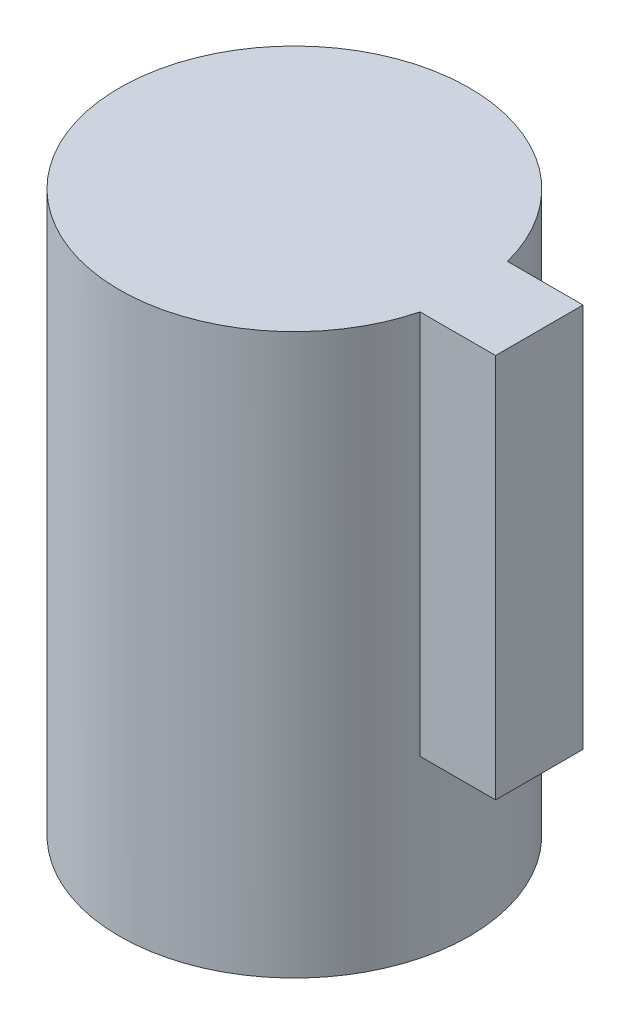
ISO-10303-21;
HEADER;
FILE_DESCRIPTION(('STEP AP214'),'2;1');
FILE_NAME('part.step','',(''),(''),'','','');
FILE_SCHEMA(('AUTOMOTIVE_DESIGN { 1 0 10303 214 1 1 1 1 }'));
ENDSEC;
DATA;
#1=APPLICATION_CONTEXT('core data for automotive mechanical design processes');
#2=APPLICATION_PROTOCOL_DEFINITION('international standard','automotive_design',2000,#1);
#3=PRODUCT_CONTEXT('',#1,'mechanical');
#4=PRODUCT('Part','Part','',(#3));
#5=PRODUCT_RELATED_PRODUCT_CATEGORY('part','',(#4));
#6=PRODUCT_DEFINITION_FORMATION('','',#4);
#7=PRODUCT_DEFINITION_CONTEXT('part definition',#1,'design');
#8=PRODUCT_DEFINITION('design','',#6,#7);
#9=PRODUCT_DEFINITION_SHAPE('','',#8);
#10=(LENGTH_UNIT() NAMED_UNIT(*) SI_UNIT(.MILLI.,.METRE.));
#11=(NAMED_UNIT(*) PLANE_ANGLE_UNIT() SI_UNIT($,.RADIAN.));
#12=(NAMED_UNIT(*) SI_UNIT($,.STERADIAN.) SOLID_ANGLE_UNIT());
#13=UNCERTAINTY_MEASURE_WITH_UNIT(LENGTH_MEASURE(1.E-05),#10,'distance_accuracy_value','');
#14=(GEOMETRIC_REPRESENTATION_CONTEXT(3) GLOBAL_UNCERTAINTY_ASSIGNED_CONTEXT((#13)) GLOBAL_UNIT_ASSIGNED_CONTEXT((#10,
#11,#12)) REPRESENTATION_CONTEXT('',''));
#15=CARTESIAN_POINT('',(0.,0.,0.));
#16=DIRECTION('',(0.,0.,1.));
#17=DIRECTION('',(1.,0.,0.));
#18=AXIS2_PLACEMENT_3D('',#15,#16,#17);
#19=CARTESIAN_POINT('',(0.,8.,0.));
#20=DIRECTION('',(0.,-1.,0.));
#21=DIRECTION('',(0.,0.,-1.));
#22=AXIS2_PLACEMENT_3D('',#19,#20,#21);
#23=CYLINDRICAL_SURFACE('',#22,5.);
#24=CARTESIAN_POINT('',(0.,8.,0.));
#25=DIRECTION('',(0.,1.,0.));
#26=DIRECTION('',(0.,0.,1.));
#27=AXIS2_PLACEMENT_3D('',#24,#25,#26);
#28=CIRCLE('',#27,5.);
#29=CARTESIAN_POINT('',(4.84122918275927,8.,-1.25));
#30=VERTEX_POINT('',#29);
#31=CARTESIAN_POINT('',(4.84122918275927,8.,1.25));
#32=VERTEX_POINT('',#31);
#33=EDGE_CURVE('E46',#30,#32,#28,.T.);
#34=ORIENTED_EDGE('',*,*,#33,.F.);
#35=DIRECTION('',(0.,-1.,0.));
#36=VECTOR('',#35,1.);
#37=CARTESIAN_POINT('',(4.84122918275927,8.,-1.25));
#38=LINE('',#37,#36);
#39=CARTESIAN_POINT('',(4.84122918275927,-3.,-1.25));
#40=VERTEX_POINT('',#39);
#41=EDGE_CURVE('E107',#30,#40,#38,.T.);
#42=ORIENTED_EDGE('',*,*,#41,.T.);
#43=CARTESIAN_POINT('',(0.,-3.,0.));
#44=DIRECTION('',(0.,1.,0.));
#45=DIRECTION('',(0.,0.,1.));
#46=AXIS2_PLACEMENT_3D('',#43,#44,#45);
#47=CIRCLE('',#46,5.);
#48=CARTESIAN_POINT('',(4.84122918275927,-3.,1.25));
#49=VERTEX_POINT('',#48);
#50=EDGE_CURVE('E11',#49,#40,#47,.T.);
#51=ORIENTED_EDGE('',*,*,#50,.F.);
#52=DIRECTION('',(0.,-1.,0.));
#53=VECTOR('',#52,1.);
#54=CARTESIAN_POINT('',(4.84122918275927,8.,1.25));
#55=LINE('',#54,#53);
#56=EDGE_CURVE('E86',#49,#32,#55,.F.);
#57=ORIENTED_EDGE('',*,*,#56,.T.);
#58=EDGE_LOOP('',(#34,#42,#51,#57));
#59=FACE_BOUND('',#58,.T.);
#60=CARTESIAN_POINT('',(0.,-8.,0.));
#61=DIRECTION('',(0.,1.,0.));
#62=DIRECTION('',(0.,0.,1.));
#63=AXIS2_PLACEMENT_3D('',#60,#61,#62);
#64=CIRCLE('',#63,5.);
#65=CARTESIAN_POINT('',(0.,-8.,5.));
#66=VERTEX_POINT('',#65);
#67=EDGE_CURVE('E110',#66,#66,#64,.T.);
#68=ORIENTED_EDGE('',*,*,#67,.T.);
#69=EDGE_LOOP('',(#68));
#70=FACE_BOUND('',#69,.T.);
#71=ADVANCED_FACE('F39',(#59,#70),#23,.T.);
#72=CARTESIAN_POINT('',(0.,8.,0.));
#73=DIRECTION('',(0.,1.,0.));
#74=DIRECTION('',(0.,0.,1.));
#75=AXIS2_PLACEMENT_3D('',#72,#73,#74);
#76=PLANE('',#75);
#77=ORIENTED_EDGE('',*,*,#33,.T.);
#78=DIRECTION('',(1.,0.,0.));
#79=VECTOR('',#78,1.);
#80=CARTESIAN_POINT('',(0.,8.,1.25));
#81=LINE('',#80,#79);
#82=CARTESIAN_POINT('',(7.,8.,1.25));
#83=VERTEX_POINT('',#82);
#84=EDGE_CURVE('E101',#32,#83,#81,.T.);
#85=ORIENTED_EDGE('',*,*,#84,.T.);
#86=DIRECTION('',(0.,0.,-1.));
#87=VECTOR('',#86,1.);
#88=CARTESIAN_POINT('',(7.,8.,-1.25));
#89=LINE('',#88,#87);
#90=CARTESIAN_POINT('',(7.,8.,-1.25));
#91=VERTEX_POINT('',#90);
#92=EDGE_CURVE('E93',#83,#91,#89,.T.);
#93=ORIENTED_EDGE('',*,*,#92,.T.);
#94=DIRECTION('',(-1.,0.,0.));
#95=VECTOR('',#94,1.);
#96=CARTESIAN_POINT('',(0.,8.,-1.25));
#97=LINE('',#96,#95);
#98=EDGE_CURVE('E53',#91,#30,#97,.T.);
#99=ORIENTED_EDGE('',*,*,#98,.T.);
#100=EDGE_LOOP('',(#77,#85,#93,#99));
#101=FACE_BOUND('',#100,.T.);
#102=ADVANCED_FACE('F118',(#101),#76,.T.);
#103=CARTESIAN_POINT('',(0.,-8.,0.));
#104=DIRECTION('',(0.,1.,0.));
#105=DIRECTION('',(0.,0.,1.));
#106=AXIS2_PLACEMENT_3D('',#103,#104,#105);
#107=PLANE('',#106);
#108=ORIENTED_EDGE('',*,*,#67,.F.);
#109=EDGE_LOOP('',(#108));
#110=FACE_BOUND('',#109,.T.);
#111=ADVANCED_FACE('F115',(#110),#107,.F.);
#112=CARTESIAN_POINT('',(0.,-3.,-1.25));
#113=DIRECTION('',(0.,0.,-1.));
#114=DIRECTION('',(-1.,0.,0.));
#115=AXIS2_PLACEMENT_3D('',#112,#113,#114);
#116=PLANE('',#115);
#117=ORIENTED_EDGE('',*,*,#41,.F.);
#118=ORIENTED_EDGE('',*,*,#98,.F.);
#119=DIRECTION('',(0.,1.,0.));
#120=VECTOR('',#119,1.);
#121=CARTESIAN_POINT('',(7.,-3.,-1.25));
#122=LINE('',#121,#120);
#123=CARTESIAN_POINT('',(7.,-3.,-1.25));
#124=VERTEX_POINT('',#123);
#125=EDGE_CURVE('E94',#124,#91,#122,.T.);
#126=ORIENTED_EDGE('',*,*,#125,.F.);
#127=DIRECTION('',(-1.,0.,0.));
#128=VECTOR('',#127,1.);
#129=CARTESIAN_POINT('',(0.,-3.,-1.25));
#130=LINE('',#129,#128);
#131=EDGE_CURVE('E95',#124,#40,#130,.T.);
#132=ORIENTED_EDGE('',*,*,#131,.T.);
#133=EDGE_LOOP('',(#117,#118,#126,#132));
#134=FACE_BOUND('',#133,.T.);
#135=ADVANCED_FACE('F117',(#134),#116,.T.);
#136=CARTESIAN_POINT('',(0.,-3.,1.25));
#137=DIRECTION('',(0.,0.,1.));
#138=DIRECTION('',(1.,0.,0.));
#139=AXIS2_PLACEMENT_3D('',#136,#137,#138);
#140=PLANE('',#139);
#141=ORIENTED_EDGE('',*,*,#56,.F.);
#142=DIRECTION('',(1.,0.,0.));
#143=VECTOR('',#142,1.);
#144=CARTESIAN_POINT('',(0.,-3.,1.25));
#145=LINE('',#144,#143);
#146=CARTESIAN_POINT('',(7.,-3.,1.25));
#147=VERTEX_POINT('',#146);
#148=EDGE_CURVE('E80',#49,#147,#145,.T.);
#149=ORIENTED_EDGE('',*,*,#148,.T.);
#150=DIRECTION('',(0.,1.,0.));
#151=VECTOR('',#150,1.);
#152=CARTESIAN_POINT('',(7.,-3.,1.25));
#153=LINE('',#152,#151);
#154=EDGE_CURVE('E83',#147,#83,#153,.T.);
#155=ORIENTED_EDGE('',*,*,#154,.T.);
#156=ORIENTED_EDGE('',*,*,#84,.F.);
#157=EDGE_LOOP('',(#141,#149,#155,#156));
#158=FACE_BOUND('',#157,.T.);
#159=ADVANCED_FACE('F82',(#158),#140,.T.);
#160=CARTESIAN_POINT('',(7.,-3.,-1.25));
#161=DIRECTION('',(1.,0.,0.));
#162=DIRECTION('',(0.,0.,-1.));
#163=AXIS2_PLACEMENT_3D('',#160,#161,#162);
#164=PLANE('',#163);
#165=ORIENTED_EDGE('',*,*,#92,.F.);
#166=ORIENTED_EDGE('',*,*,#154,.F.);
#167=DIRECTION('',(0.,0.,-1.));
#168=VECTOR('',#167,1.);
#169=CARTESIAN_POINT('',(7.,-3.,-1.25));
#170=LINE('',#169,#168);
#171=EDGE_CURVE('E88',#147,#124,#170,.T.);
#172=ORIENTED_EDGE('',*,*,#171,.T.);
#173=ORIENTED_EDGE('',*,*,#125,.T.);
#174=EDGE_LOOP('',(#165,#166,#172,#173));
#175=FACE_BOUND('',#174,.T.);
#176=ADVANCED_FACE('F92',(#175),#164,.T.);
#177=CARTESIAN_POINT('',(0.,-3.,0.));
#178=DIRECTION('',(0.,1.,0.));
#179=DIRECTION('',(0.,0.,1.));
#180=AXIS2_PLACEMENT_3D('',#177,#178,#179);
#181=PLANE('',#180);
#182=ORIENTED_EDGE('',*,*,#148,.F.);
#183=ORIENTED_EDGE('',*,*,#50,.T.);
#184=ORIENTED_EDGE('',*,*,#131,.F.);
#185=ORIENTED_EDGE('',*,*,#171,.F.);
#186=EDGE_LOOP('',(#182,#183,#184,#185));
#187=FACE_BOUND('',#186,.T.);
#188=ADVANCED_FACE('F97',(#187),#181,.F.);
#189=CLOSED_SHELL('',(#71,#102,#111,#135,#159,#176,#188));
#190=MANIFOLD_SOLID_BREP('B2',#189);
#191=ADVANCED_BREP_SHAPE_REPRESENTATION('',(#18,#190),#14);
#192=SHAPE_DEFINITION_REPRESENTATION(#9,#191);
ENDSEC;
END-ISO-10303-21;
